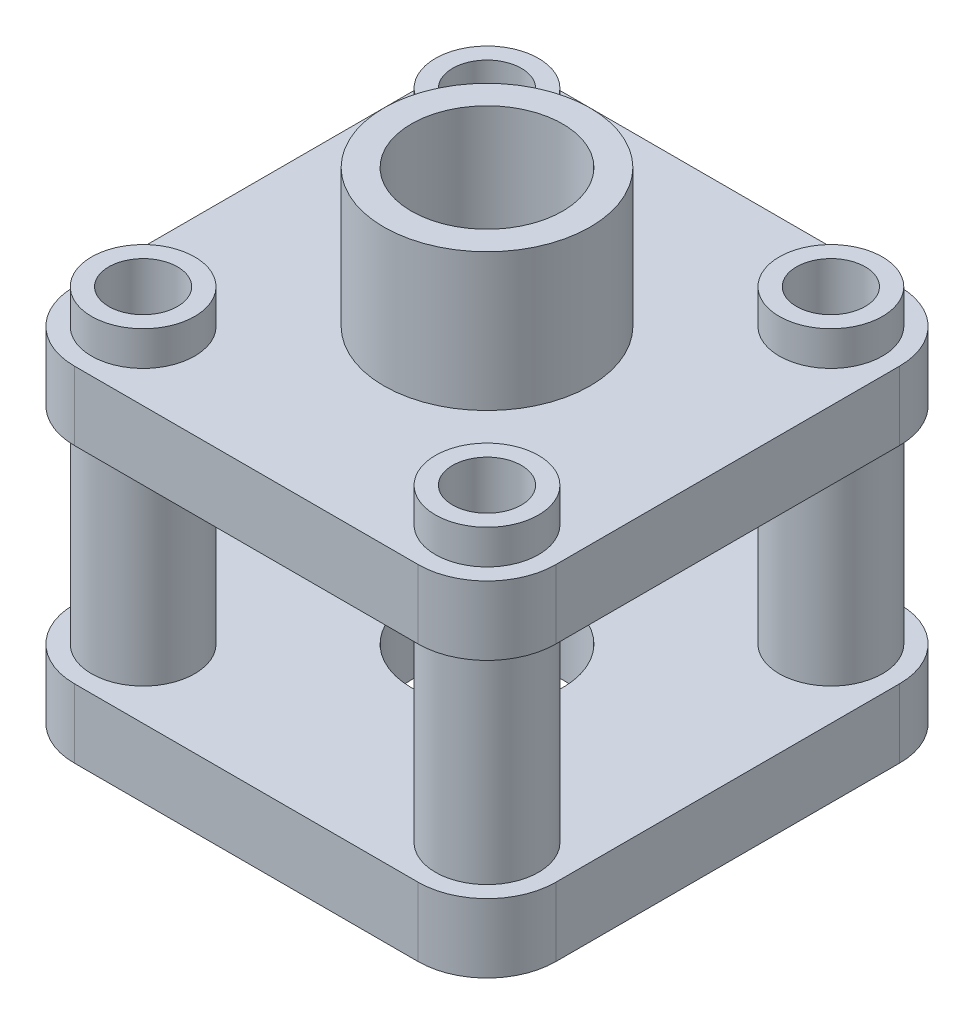
ISO-10303-21;
HEADER;
FILE_DESCRIPTION(('STEP AP214'),'2;1');
FILE_NAME('part.step','',(''),(''),'','','');
FILE_SCHEMA(('AUTOMOTIVE_DESIGN { 1 0 10303 214 1 1 1 1 }'));
ENDSEC;
DATA;
#1=APPLICATION_CONTEXT('core data for automotive mechanical design processes');
#2=APPLICATION_PROTOCOL_DEFINITION('international standard','automotive_design',2000,#1);
#3=PRODUCT_CONTEXT('',#1,'mechanical');
#4=PRODUCT('Part','Part','',(#3));
#5=PRODUCT_RELATED_PRODUCT_CATEGORY('part','',(#4));
#6=PRODUCT_DEFINITION_FORMATION('','',#4);
#7=PRODUCT_DEFINITION_CONTEXT('part definition',#1,'design');
#8=PRODUCT_DEFINITION('design','',#6,#7);
#9=PRODUCT_DEFINITION_SHAPE('','',#8);
#10=(LENGTH_UNIT() NAMED_UNIT(*) SI_UNIT(.MILLI.,.METRE.));
#11=(NAMED_UNIT(*) PLANE_ANGLE_UNIT() SI_UNIT($,.RADIAN.));
#12=(NAMED_UNIT(*) SI_UNIT($,.STERADIAN.) SOLID_ANGLE_UNIT());
#13=UNCERTAINTY_MEASURE_WITH_UNIT(LENGTH_MEASURE(1.E-05),#10,'distance_accuracy_value','');
#14=(GEOMETRIC_REPRESENTATION_CONTEXT(3) GLOBAL_UNCERTAINTY_ASSIGNED_CONTEXT((#13)) GLOBAL_UNIT_ASSIGNED_CONTEXT((#10,
#11,#12)) REPRESENTATION_CONTEXT('',''));
#15=CARTESIAN_POINT('',(0.,0.,0.));
#16=DIRECTION('',(0.,0.,1.));
#17=DIRECTION('',(1.,0.,0.));
#18=AXIS2_PLACEMENT_3D('',#15,#16,#17);
#19=CARTESIAN_POINT('',(-25.,40.,-25.));
#20=DIRECTION('',(0.,-1.,0.));
#21=DIRECTION('',(0.,0.,-1.));
#22=AXIS2_PLACEMENT_3D('',#19,#20,#21);
#23=CYLINDRICAL_SURFACE('',#22,7.5);
#24=CARTESIAN_POINT('',(-25.,10.,-25.));
#25=DIRECTION('',(0.,1.,0.));
#26=DIRECTION('',(0.,0.,1.));
#27=AXIS2_PLACEMENT_3D('',#24,#25,#26);
#28=CIRCLE('',#27,7.5);
#29=CARTESIAN_POINT('',(-25.,10.,-17.5));
#30=VERTEX_POINT('',#29);
#31=EDGE_CURVE('E143',#30,#30,#28,.F.);
#32=ORIENTED_EDGE('',*,*,#31,.F.);
#33=EDGE_LOOP('',(#32));
#34=FACE_BOUND('',#33,.T.);
#35=CARTESIAN_POINT('',(-25.,40.,-25.));
#36=DIRECTION('',(0.,1.,0.));
#37=DIRECTION('',(0.,0.,1.));
#38=AXIS2_PLACEMENT_3D('',#35,#36,#37);
#39=CIRCLE('',#38,7.5);
#40=CARTESIAN_POINT('',(-25.,40.,-17.5));
#41=VERTEX_POINT('',#40);
#42=EDGE_CURVE('E11',#41,#41,#39,.T.);
#43=ORIENTED_EDGE('',*,*,#42,.F.);
#44=EDGE_LOOP('',(#43));
#45=FACE_BOUND('',#44,.T.);
#46=ADVANCED_FACE('F39',(#34,#45),#23,.T.);
#47=CARTESIAN_POINT('',(25.,40.,-25.));
#48=DIRECTION('',(0.,-1.,0.));
#49=DIRECTION('',(0.,0.,-1.));
#50=AXIS2_PLACEMENT_3D('',#47,#48,#49);
#51=CYLINDRICAL_SURFACE('',#50,7.49999999999999);
#52=CARTESIAN_POINT('',(25.,10.,-25.));
#53=DIRECTION('',(0.,1.,0.));
#54=DIRECTION('',(0.,0.,1.));
#55=AXIS2_PLACEMENT_3D('',#52,#53,#54);
#56=CIRCLE('',#55,7.49999999999999);
#57=CARTESIAN_POINT('',(25.,10.,-17.5));
#58=VERTEX_POINT('',#57);
#59=EDGE_CURVE('E189',#58,#58,#56,.T.);
#60=ORIENTED_EDGE('',*,*,#59,.T.);
#61=EDGE_LOOP('',(#60));
#62=FACE_BOUND('',#61,.T.);
#63=CARTESIAN_POINT('',(25.,40.,-25.));
#64=DIRECTION('',(0.,1.,0.));
#65=DIRECTION('',(0.,0.,1.));
#66=AXIS2_PLACEMENT_3D('',#63,#64,#65);
#67=CIRCLE('',#66,7.49999999999999);
#68=CARTESIAN_POINT('',(25.,40.,-17.5));
#69=VERTEX_POINT('',#68);
#70=EDGE_CURVE('E339',#69,#69,#67,.T.);
#71=ORIENTED_EDGE('',*,*,#70,.F.);
#72=EDGE_LOOP('',(#71));
#73=FACE_BOUND('',#72,.T.);
#74=ADVANCED_FACE('F208',(#62,#73),#51,.T.);
#75=CARTESIAN_POINT('',(-25.,40.,25.));
#76=DIRECTION('',(0.,-1.,0.));
#77=DIRECTION('',(0.,0.,-1.));
#78=AXIS2_PLACEMENT_3D('',#75,#76,#77);
#79=CYLINDRICAL_SURFACE('',#78,7.5);
#80=CARTESIAN_POINT('',(-25.,10.,25.));
#81=DIRECTION('',(0.,1.,0.));
#82=DIRECTION('',(0.,0.,1.));
#83=AXIS2_PLACEMENT_3D('',#80,#81,#82);
#84=CIRCLE('',#83,7.5);
#85=CARTESIAN_POINT('',(-25.,10.,32.5));
#86=VERTEX_POINT('',#85);
#87=EDGE_CURVE('E194',#86,#86,#84,.T.);
#88=ORIENTED_EDGE('',*,*,#87,.T.);
#89=EDGE_LOOP('',(#88));
#90=FACE_BOUND('',#89,.T.);
#91=CARTESIAN_POINT('',(-25.,40.,25.));
#92=DIRECTION('',(0.,1.,0.));
#93=DIRECTION('',(0.,0.,1.));
#94=AXIS2_PLACEMENT_3D('',#91,#92,#93);
#95=CIRCLE('',#94,7.5);
#96=CARTESIAN_POINT('',(-25.,40.,32.5));
#97=VERTEX_POINT('',#96);
#98=EDGE_CURVE('E341',#97,#97,#95,.T.);
#99=ORIENTED_EDGE('',*,*,#98,.F.);
#100=EDGE_LOOP('',(#99));
#101=FACE_BOUND('',#100,.T.);
#102=ADVANCED_FACE('F282',(#90,#101),#79,.T.);
#103=CARTESIAN_POINT('',(25.,40.,25.));
#104=DIRECTION('',(0.,-1.,0.));
#105=DIRECTION('',(0.,0.,-1.));
#106=AXIS2_PLACEMENT_3D('',#103,#104,#105);
#107=CYLINDRICAL_SURFACE('',#106,7.49999999999999);
#108=CARTESIAN_POINT('',(25.,10.,25.));
#109=DIRECTION('',(0.,1.,0.));
#110=DIRECTION('',(0.,0.,1.));
#111=AXIS2_PLACEMENT_3D('',#108,#109,#110);
#112=CIRCLE('',#111,7.49999999999999);
#113=CARTESIAN_POINT('',(25.,10.,32.5));
#114=VERTEX_POINT('',#113);
#115=EDGE_CURVE('E232',#114,#114,#112,.F.);
#116=ORIENTED_EDGE('',*,*,#115,.F.);
#117=EDGE_LOOP('',(#116));
#118=FACE_BOUND('',#117,.T.);
#119=CARTESIAN_POINT('',(25.,40.,25.));
#120=DIRECTION('',(0.,1.,0.));
#121=DIRECTION('',(0.,0.,1.));
#122=AXIS2_PLACEMENT_3D('',#119,#120,#121);
#123=CIRCLE('',#122,7.49999999999999);
#124=CARTESIAN_POINT('',(25.,40.,32.5));
#125=VERTEX_POINT('',#124);
#126=EDGE_CURVE('E190',#125,#125,#123,.T.);
#127=ORIENTED_EDGE('',*,*,#126,.F.);
#128=EDGE_LOOP('',(#127));
#129=FACE_BOUND('',#128,.T.);
#130=ADVANCED_FACE('F413',(#118,#129),#107,.T.);
#131=CARTESIAN_POINT('',(0.,10.,-35.));
#132=DIRECTION('',(0.,0.,-1.));
#133=DIRECTION('',(-1.,0.,0.));
#134=AXIS2_PLACEMENT_3D('',#131,#132,#133);
#135=PLANE('',#134);
#136=DIRECTION('',(1.,0.,0.));
#137=VECTOR('',#136,1.);
#138=CARTESIAN_POINT('',(0.,0.,-35.));
#139=LINE('',#138,#137);
#140=CARTESIAN_POINT('',(-24.9999999999999,0.,-35.));
#141=VERTEX_POINT('',#140);
#142=CARTESIAN_POINT('',(24.9999999999999,0.,-35.));
#143=VERTEX_POINT('',#142);
#144=EDGE_CURVE('E142',#141,#143,#139,.T.);
#145=ORIENTED_EDGE('',*,*,#144,.F.);
#146=DIRECTION('',(0.,-1.,0.));
#147=VECTOR('',#146,1.);
#148=CARTESIAN_POINT('',(-24.9999999999999,10.,-35.));
#149=LINE('',#148,#147);
#150=CARTESIAN_POINT('',(-24.9999999999999,10.,-35.));
#151=VERTEX_POINT('',#150);
#152=EDGE_CURVE('E92',#151,#141,#149,.T.);
#153=ORIENTED_EDGE('',*,*,#152,.F.);
#154=DIRECTION('',(1.,0.,0.));
#155=VECTOR('',#154,1.);
#156=CARTESIAN_POINT('',(0.,10.,-35.));
#157=LINE('',#156,#155);
#158=CARTESIAN_POINT('',(24.9999999999999,10.,-35.));
#159=VERTEX_POINT('',#158);
#160=EDGE_CURVE('E243',#151,#159,#157,.T.);
#161=ORIENTED_EDGE('',*,*,#160,.T.);
#162=DIRECTION('',(0.,-1.,0.));
#163=VECTOR('',#162,1.);
#164=CARTESIAN_POINT('',(24.9999999999999,10.,-35.));
#165=LINE('',#164,#163);
#166=EDGE_CURVE('E56',#159,#143,#165,.T.);
#167=ORIENTED_EDGE('',*,*,#166,.T.);
#168=EDGE_LOOP('',(#145,#153,#161,#167));
#169=FACE_BOUND('',#168,.T.);
#170=ADVANCED_FACE('F424',(#169),#135,.T.);
#171=CARTESIAN_POINT('',(-25.,10.,-25.));
#172=DIRECTION('',(0.,-1.,0.));
#173=DIRECTION('',(0.,0.,-1.));
#174=AXIS2_PLACEMENT_3D('',#171,#172,#173);
#175=CYLINDRICAL_SURFACE('',#174,10.);
#176=CARTESIAN_POINT('',(-25.,0.,-25.));
#177=DIRECTION('',(0.,1.,0.));
#178=DIRECTION('',(0.,0.,1.));
#179=AXIS2_PLACEMENT_3D('',#176,#177,#178);
#180=CIRCLE('',#179,10.);
#181=CARTESIAN_POINT('',(-35.,0.,-24.9999999999999));
#182=VERTEX_POINT('',#181);
#183=EDGE_CURVE('E145',#141,#182,#180,.T.);
#184=ORIENTED_EDGE('',*,*,#183,.T.);
#185=DIRECTION('',(0.,-1.,0.));
#186=VECTOR('',#185,1.);
#187=CARTESIAN_POINT('',(-35.,10.,-24.9999999999999));
#188=LINE('',#187,#186);
#189=CARTESIAN_POINT('',(-35.,10.,-24.9999999999999));
#190=VERTEX_POINT('',#189);
#191=EDGE_CURVE('E185',#190,#182,#188,.T.);
#192=ORIENTED_EDGE('',*,*,#191,.F.);
#193=CARTESIAN_POINT('',(-25.,10.,-25.));
#194=DIRECTION('',(0.,1.,0.));
#195=DIRECTION('',(0.,0.,1.));
#196=AXIS2_PLACEMENT_3D('',#193,#194,#195);
#197=CIRCLE('',#196,10.);
#198=EDGE_CURVE('E245',#151,#190,#197,.T.);
#199=ORIENTED_EDGE('',*,*,#198,.F.);
#200=ORIENTED_EDGE('',*,*,#152,.T.);
#201=EDGE_LOOP('',(#184,#192,#199,#200));
#202=FACE_BOUND('',#201,.T.);
#203=ADVANCED_FACE('F430',(#202),#175,.T.);
#204=CARTESIAN_POINT('',(-35.,10.,0.));
#205=DIRECTION('',(1.,0.,0.));
#206=DIRECTION('',(0.,0.,-1.));
#207=AXIS2_PLACEMENT_3D('',#204,#205,#206);
#208=PLANE('',#207);
#209=DIRECTION('',(0.,0.,1.));
#210=VECTOR('',#209,1.);
#211=CARTESIAN_POINT('',(-35.,0.,0.));
#212=LINE('',#211,#210);
#213=CARTESIAN_POINT('',(-35.,0.,24.9999999999999));
#214=VERTEX_POINT('',#213);
#215=EDGE_CURVE('E148',#182,#214,#212,.T.);
#216=ORIENTED_EDGE('',*,*,#215,.T.);
#217=DIRECTION('',(0.,-1.,0.));
#218=VECTOR('',#217,1.);
#219=CARTESIAN_POINT('',(-35.,10.,24.9999999999999));
#220=LINE('',#219,#218);
#221=CARTESIAN_POINT('',(-35.,10.,24.9999999999999));
#222=VERTEX_POINT('',#221);
#223=EDGE_CURVE('E182',#222,#214,#220,.T.);
#224=ORIENTED_EDGE('',*,*,#223,.F.);
#225=DIRECTION('',(0.,0.,1.));
#226=VECTOR('',#225,1.);
#227=CARTESIAN_POINT('',(-35.,10.,0.));
#228=LINE('',#227,#226);
#229=EDGE_CURVE('E248',#190,#222,#228,.T.);
#230=ORIENTED_EDGE('',*,*,#229,.F.);
#231=ORIENTED_EDGE('',*,*,#191,.T.);
#232=EDGE_LOOP('',(#216,#224,#230,#231));
#233=FACE_BOUND('',#232,.T.);
#234=ADVANCED_FACE('F825',(#233),#208,.F.);
#235=CARTESIAN_POINT('',(-25.,10.,25.));
#236=DIRECTION('',(0.,-1.,0.));
#237=DIRECTION('',(0.,0.,-1.));
#238=AXIS2_PLACEMENT_3D('',#235,#236,#237);
#239=CYLINDRICAL_SURFACE('',#238,10.);
#240=CARTESIAN_POINT('',(-25.,0.,25.));
#241=DIRECTION('',(0.,1.,0.));
#242=DIRECTION('',(0.,0.,1.));
#243=AXIS2_PLACEMENT_3D('',#240,#241,#242);
#244=CIRCLE('',#243,10.);
#245=CARTESIAN_POINT('',(-24.9999999999999,0.,35.));
#246=VERTEX_POINT('',#245);
#247=EDGE_CURVE('E151',#214,#246,#244,.T.);
#248=ORIENTED_EDGE('',*,*,#247,.T.);
#249=DIRECTION('',(0.,-1.,0.));
#250=VECTOR('',#249,1.);
#251=CARTESIAN_POINT('',(-24.9999999999999,10.,35.));
#252=LINE('',#251,#250);
#253=CARTESIAN_POINT('',(-24.9999999999999,10.,35.));
#254=VERTEX_POINT('',#253);
#255=EDGE_CURVE('E179',#254,#246,#252,.T.);
#256=ORIENTED_EDGE('',*,*,#255,.F.);
#257=CARTESIAN_POINT('',(-25.,10.,25.));
#258=DIRECTION('',(0.,1.,0.));
#259=DIRECTION('',(0.,0.,1.));
#260=AXIS2_PLACEMENT_3D('',#257,#258,#259);
#261=CIRCLE('',#260,10.);
#262=EDGE_CURVE('E251',#222,#254,#261,.T.);
#263=ORIENTED_EDGE('',*,*,#262,.F.);
#264=ORIENTED_EDGE('',*,*,#223,.T.);
#265=EDGE_LOOP('',(#248,#256,#263,#264));
#266=FACE_BOUND('',#265,.T.);
#267=ADVANCED_FACE('F255',(#266),#239,.T.);
#268=CARTESIAN_POINT('',(0.,10.,35.));
#269=DIRECTION('',(0.,0.,-1.));
#270=DIRECTION('',(-1.,0.,0.));
#271=AXIS2_PLACEMENT_3D('',#268,#269,#270);
#272=PLANE('',#271);
#273=DIRECTION('',(1.,0.,0.));
#274=VECTOR('',#273,1.);
#275=CARTESIAN_POINT('',(0.,0.,35.));
#276=LINE('',#275,#274);
#277=CARTESIAN_POINT('',(24.9999999999999,0.,35.));
#278=VERTEX_POINT('',#277);
#279=EDGE_CURVE('E154',#246,#278,#276,.T.);
#280=ORIENTED_EDGE('',*,*,#279,.T.);
#281=DIRECTION('',(0.,-1.,0.));
#282=VECTOR('',#281,1.);
#283=CARTESIAN_POINT('',(24.9999999999999,10.,35.));
#284=LINE('',#283,#282);
#285=CARTESIAN_POINT('',(24.9999999999999,10.,35.));
#286=VERTEX_POINT('',#285);
#287=EDGE_CURVE('E131',#286,#278,#284,.T.);
#288=ORIENTED_EDGE('',*,*,#287,.F.);
#289=DIRECTION('',(1.,0.,0.));
#290=VECTOR('',#289,1.);
#291=CARTESIAN_POINT('',(0.,10.,35.));
#292=LINE('',#291,#290);
#293=EDGE_CURVE('E120',#254,#286,#292,.T.);
#294=ORIENTED_EDGE('',*,*,#293,.F.);
#295=ORIENTED_EDGE('',*,*,#255,.T.);
#296=EDGE_LOOP('',(#280,#288,#294,#295));
#297=FACE_BOUND('',#296,.T.);
#298=ADVANCED_FACE('F257',(#297),#272,.F.);
#299=CARTESIAN_POINT('',(25.,10.,25.));
#300=DIRECTION('',(0.,-1.,0.));
#301=DIRECTION('',(0.,0.,-1.));
#302=AXIS2_PLACEMENT_3D('',#299,#300,#301);
#303=CYLINDRICAL_SURFACE('',#302,10.);
#304=CARTESIAN_POINT('',(25.,0.,25.));
#305=DIRECTION('',(0.,1.,0.));
#306=DIRECTION('',(0.,0.,1.));
#307=AXIS2_PLACEMENT_3D('',#304,#305,#306);
#308=CIRCLE('',#307,10.);
#309=CARTESIAN_POINT('',(35.,0.,24.9999999999999));
#310=VERTEX_POINT('',#309);
#311=EDGE_CURVE('E128',#278,#310,#308,.T.);
#312=ORIENTED_EDGE('',*,*,#311,.T.);
#313=DIRECTION('',(0.,-1.,0.));
#314=VECTOR('',#313,1.);
#315=CARTESIAN_POINT('',(35.,10.,24.9999999999999));
#316=LINE('',#315,#314);
#317=CARTESIAN_POINT('',(35.,10.,24.9999999999999));
#318=VERTEX_POINT('',#317);
#319=EDGE_CURVE('E126',#318,#310,#316,.T.);
#320=ORIENTED_EDGE('',*,*,#319,.F.);
#321=CARTESIAN_POINT('',(25.,10.,25.));
#322=DIRECTION('',(0.,1.,0.));
#323=DIRECTION('',(0.,0.,1.));
#324=AXIS2_PLACEMENT_3D('',#321,#322,#323);
#325=CIRCLE('',#324,10.);
#326=EDGE_CURVE('E112',#286,#318,#325,.T.);
#327=ORIENTED_EDGE('',*,*,#326,.F.);
#328=ORIENTED_EDGE('',*,*,#287,.T.);
#329=EDGE_LOOP('',(#312,#320,#327,#328));
#330=FACE_BOUND('',#329,.T.);
#331=ADVANCED_FACE('F127',(#330),#303,.T.);
#332=CARTESIAN_POINT('',(35.,10.,0.));
#333=DIRECTION('',(1.,0.,0.));
#334=DIRECTION('',(0.,0.,-1.));
#335=AXIS2_PLACEMENT_3D('',#332,#333,#334);
#336=PLANE('',#335);
#337=DIRECTION('',(0.,0.,1.));
#338=VECTOR('',#337,1.);
#339=CARTESIAN_POINT('',(35.,0.,0.));
#340=LINE('',#339,#338);
#341=CARTESIAN_POINT('',(35.,0.,-24.9999999999999));
#342=VERTEX_POINT('',#341);
#343=EDGE_CURVE('E158',#342,#310,#340,.T.);
#344=ORIENTED_EDGE('',*,*,#343,.F.);
#345=DIRECTION('',(0.,-1.,0.));
#346=VECTOR('',#345,1.);
#347=CARTESIAN_POINT('',(35.,10.,-24.9999999999999));
#348=LINE('',#347,#346);
#349=CARTESIAN_POINT('',(35.,10.,-24.9999999999999));
#350=VERTEX_POINT('',#349);
#351=EDGE_CURVE('E83',#350,#342,#348,.T.);
#352=ORIENTED_EDGE('',*,*,#351,.F.);
#353=DIRECTION('',(0.,0.,1.));
#354=VECTOR('',#353,1.);
#355=CARTESIAN_POINT('',(35.,10.,0.));
#356=LINE('',#355,#354);
#357=EDGE_CURVE('E118',#350,#318,#356,.T.);
#358=ORIENTED_EDGE('',*,*,#357,.T.);
#359=ORIENTED_EDGE('',*,*,#319,.T.);
#360=EDGE_LOOP('',(#344,#352,#358,#359));
#361=FACE_BOUND('',#360,.T.);
#362=ADVANCED_FACE('F133',(#361),#336,.T.);
#363=CARTESIAN_POINT('',(-25.,10.,-25.));
#364=DIRECTION('',(0.,-1.,0.));
#365=DIRECTION('',(0.,0.,-1.));
#366=AXIS2_PLACEMENT_3D('',#363,#364,#365);
#367=CYLINDRICAL_SURFACE('',#366,5.);
#368=CARTESIAN_POINT('',(-25.,0.,-25.));
#369=DIRECTION('',(0.,1.,0.));
#370=DIRECTION('',(0.,0.,1.));
#371=AXIS2_PLACEMENT_3D('',#368,#369,#370);
#372=CIRCLE('',#371,5.);
#373=CARTESIAN_POINT('',(-25.,0.,-20.));
#374=VERTEX_POINT('',#373);
#375=EDGE_CURVE('E169',#374,#374,#372,.T.);
#376=ORIENTED_EDGE('',*,*,#375,.F.);
#377=EDGE_LOOP('',(#376));
#378=FACE_BOUND('',#377,.T.);
#379=CARTESIAN_POINT('',(-25.,55.,-25.));
#380=DIRECTION('',(0.,1.,0.));
#381=DIRECTION('',(0.,0.,1.));
#382=AXIS2_PLACEMENT_3D('',#379,#380,#381);
#383=CIRCLE('',#382,5.);
#384=CARTESIAN_POINT('',(-25.,55.,-20.));
#385=VERTEX_POINT('',#384);
#386=EDGE_CURVE('E217',#385,#385,#383,.F.);
#387=ORIENTED_EDGE('',*,*,#386,.F.);
#388=EDGE_LOOP('',(#387));
#389=FACE_BOUND('',#388,.T.);
#390=ADVANCED_FACE('F308',(#378,#389),#367,.F.);
#391=CARTESIAN_POINT('',(25.,10.,-25.));
#392=DIRECTION('',(0.,-1.,0.));
#393=DIRECTION('',(0.,0.,-1.));
#394=AXIS2_PLACEMENT_3D('',#391,#392,#393);
#395=CYLINDRICAL_SURFACE('',#394,4.99999999999999);
#396=CARTESIAN_POINT('',(25.,0.,-25.));
#397=DIRECTION('',(0.,1.,0.));
#398=DIRECTION('',(0.,0.,1.));
#399=AXIS2_PLACEMENT_3D('',#396,#397,#398);
#400=CIRCLE('',#399,4.99999999999999);
#401=CARTESIAN_POINT('',(25.,0.,-20.));
#402=VERTEX_POINT('',#401);
#403=EDGE_CURVE('E166',#402,#402,#400,.F.);
#404=ORIENTED_EDGE('',*,*,#403,.T.);
#405=EDGE_LOOP('',(#404));
#406=FACE_BOUND('',#405,.T.);
#407=CARTESIAN_POINT('',(25.,55.,-25.));
#408=DIRECTION('',(0.,1.,0.));
#409=DIRECTION('',(0.,0.,1.));
#410=AXIS2_PLACEMENT_3D('',#407,#408,#409);
#411=CIRCLE('',#410,4.99999999999999);
#412=CARTESIAN_POINT('',(25.,55.,-20.));
#413=VERTEX_POINT('',#412);
#414=EDGE_CURVE('E214',#413,#413,#411,.T.);
#415=ORIENTED_EDGE('',*,*,#414,.T.);
#416=EDGE_LOOP('',(#415));
#417=FACE_BOUND('',#416,.T.);
#418=ADVANCED_FACE('F272',(#406,#417),#395,.F.);
#419=CARTESIAN_POINT('',(-25.,10.,25.));
#420=DIRECTION('',(0.,-1.,0.));
#421=DIRECTION('',(0.,0.,-1.));
#422=AXIS2_PLACEMENT_3D('',#419,#420,#421);
#423=CYLINDRICAL_SURFACE('',#422,5.);
#424=CARTESIAN_POINT('',(-25.,0.,25.));
#425=DIRECTION('',(0.,1.,0.));
#426=DIRECTION('',(0.,0.,1.));
#427=AXIS2_PLACEMENT_3D('',#424,#425,#426);
#428=CIRCLE('',#427,5.);
#429=CARTESIAN_POINT('',(-25.,0.,30.));
#430=VERTEX_POINT('',#429);
#431=EDGE_CURVE('E163',#430,#430,#428,.F.);
#432=ORIENTED_EDGE('',*,*,#431,.T.);
#433=EDGE_LOOP('',(#432));
#434=FACE_BOUND('',#433,.T.);
#435=CARTESIAN_POINT('',(-25.,55.,25.));
#436=DIRECTION('',(0.,1.,0.));
#437=DIRECTION('',(0.,0.,1.));
#438=AXIS2_PLACEMENT_3D('',#435,#436,#437);
#439=CIRCLE('',#438,5.);
#440=CARTESIAN_POINT('',(-25.,55.,30.));
#441=VERTEX_POINT('',#440);
#442=EDGE_CURVE('E226',#441,#441,#439,.T.);
#443=ORIENTED_EDGE('',*,*,#442,.T.);
#444=EDGE_LOOP('',(#443));
#445=FACE_BOUND('',#444,.T.);
#446=ADVANCED_FACE('F264',(#434,#445),#423,.F.);
#447=CARTESIAN_POINT('',(25.,10.,-25.));
#448=DIRECTION('',(0.,-1.,0.));
#449=DIRECTION('',(0.,0.,-1.));
#450=AXIS2_PLACEMENT_3D('',#447,#448,#449);
#451=CYLINDRICAL_SURFACE('',#450,10.);
#452=CARTESIAN_POINT('',(25.,0.,-25.));
#453=DIRECTION('',(0.,1.,0.));
#454=DIRECTION('',(0.,0.,1.));
#455=AXIS2_PLACEMENT_3D('',#452,#453,#454);
#456=CIRCLE('',#455,10.);
#457=EDGE_CURVE('E160',#143,#342,#456,.F.);
#458=ORIENTED_EDGE('',*,*,#457,.F.);
#459=ORIENTED_EDGE('',*,*,#166,.F.);
#460=CARTESIAN_POINT('',(25.,10.,-25.));
#461=DIRECTION('',(0.,1.,0.));
#462=DIRECTION('',(0.,0.,1.));
#463=AXIS2_PLACEMENT_3D('',#460,#461,#462);
#464=CIRCLE('',#463,10.);
#465=EDGE_CURVE('E134',#159,#350,#464,.F.);
#466=ORIENTED_EDGE('',*,*,#465,.T.);
#467=ORIENTED_EDGE('',*,*,#351,.T.);
#468=EDGE_LOOP('',(#458,#459,#466,#467));
#469=FACE_BOUND('',#468,.T.);
#470=ADVANCED_FACE('F262',(#469),#451,.T.);
#471=CARTESIAN_POINT('',(0.,10.,0.));
#472=DIRECTION('',(0.,-1.,0.));
#473=DIRECTION('',(0.,0.,-1.));
#474=AXIS2_PLACEMENT_3D('',#471,#472,#473);
#475=CYLINDRICAL_SURFACE('',#474,11.);
#476=CARTESIAN_POINT('',(0.,10.,0.));
#477=DIRECTION('',(0.,1.,0.));
#478=DIRECTION('',(0.,0.,1.));
#479=AXIS2_PLACEMENT_3D('',#476,#477,#478);
#480=CIRCLE('',#479,11.);
#481=CARTESIAN_POINT('',(0.,10.,11.));
#482=VERTEX_POINT('',#481);
#483=EDGE_CURVE('E175',#482,#482,#480,.T.);
#484=ORIENTED_EDGE('',*,*,#483,.T.);
#485=EDGE_LOOP('',(#484));
#486=FACE_BOUND('',#485,.T.);
#487=CARTESIAN_POINT('',(0.,0.,0.));
#488=DIRECTION('',(0.,1.,0.));
#489=DIRECTION('',(0.,0.,1.));
#490=AXIS2_PLACEMENT_3D('',#487,#488,#489);
#491=CIRCLE('',#490,11.);
#492=CARTESIAN_POINT('',(0.,0.,11.));
#493=VERTEX_POINT('',#492);
#494=EDGE_CURVE('E139',#493,#493,#491,.T.);
#495=ORIENTED_EDGE('',*,*,#494,.F.);
#496=EDGE_LOOP('',(#495));
#497=FACE_BOUND('',#496,.T.);
#498=ADVANCED_FACE('F41',(#486,#497),#475,.F.);
#499=CARTESIAN_POINT('',(25.,10.,25.));
#500=DIRECTION('',(0.,-1.,0.));
#501=DIRECTION('',(0.,0.,-1.));
#502=AXIS2_PLACEMENT_3D('',#499,#500,#501);
#503=CYLINDRICAL_SURFACE('',#502,4.99999999999999);
#504=CARTESIAN_POINT('',(25.,0.,25.));
#505=DIRECTION('',(0.,1.,0.));
#506=DIRECTION('',(0.,0.,1.));
#507=AXIS2_PLACEMENT_3D('',#504,#505,#506);
#508=CIRCLE('',#507,4.99999999999999);
#509=CARTESIAN_POINT('',(25.,0.,30.));
#510=VERTEX_POINT('',#509);
#511=EDGE_CURVE('E172',#510,#510,#508,.T.);
#512=ORIENTED_EDGE('',*,*,#511,.F.);
#513=EDGE_LOOP('',(#512));
#514=FACE_BOUND('',#513,.T.);
#515=CARTESIAN_POINT('',(25.,55.,25.));
#516=DIRECTION('',(0.,1.,0.));
#517=DIRECTION('',(0.,0.,1.));
#518=AXIS2_PLACEMENT_3D('',#515,#516,#517);
#519=CIRCLE('',#518,4.99999999999999);
#520=CARTESIAN_POINT('',(25.,55.,30.));
#521=VERTEX_POINT('',#520);
#522=EDGE_CURVE('E402',#521,#521,#519,.T.);
#523=ORIENTED_EDGE('',*,*,#522,.T.);
#524=EDGE_LOOP('',(#523));
#525=FACE_BOUND('',#524,.T.);
#526=ADVANCED_FACE('F270',(#514,#525),#503,.F.);
#527=CARTESIAN_POINT('',(0.,10.,0.));
#528=DIRECTION('',(0.,1.,0.));
#529=DIRECTION('',(0.,0.,1.));
#530=AXIS2_PLACEMENT_3D('',#527,#528,#529);
#531=PLANE('',#530);
#532=ORIENTED_EDGE('',*,*,#115,.T.);
#533=EDGE_LOOP('',(#532));
#534=FACE_BOUND('',#533,.T.);
#535=ORIENTED_EDGE('',*,*,#87,.F.);
#536=EDGE_LOOP('',(#535));
#537=FACE_BOUND('',#536,.T.);
#538=ORIENTED_EDGE('',*,*,#59,.F.);
#539=EDGE_LOOP('',(#538));
#540=FACE_BOUND('',#539,.T.);
#541=ORIENTED_EDGE('',*,*,#31,.T.);
#542=EDGE_LOOP('',(#541));
#543=FACE_BOUND('',#542,.T.);
#544=ORIENTED_EDGE('',*,*,#483,.F.);
#545=EDGE_LOOP('',(#544));
#546=FACE_BOUND('',#545,.T.);
#547=ORIENTED_EDGE('',*,*,#160,.F.);
#548=ORIENTED_EDGE('',*,*,#198,.T.);
#549=ORIENTED_EDGE('',*,*,#229,.T.);
#550=ORIENTED_EDGE('',*,*,#262,.T.);
#551=ORIENTED_EDGE('',*,*,#293,.T.);
#552=ORIENTED_EDGE('',*,*,#326,.T.);
#553=ORIENTED_EDGE('',*,*,#357,.F.);
#554=ORIENTED_EDGE('',*,*,#465,.F.);
#555=EDGE_LOOP('',(#547,#548,#549,#550,#551,#552,#553,#554));
#556=FACE_BOUND('',#555,.T.);
#557=ADVANCED_FACE('F115',(#534,#537,#540,#543,#546,#556),#531,.T.);
#558=CARTESIAN_POINT('',(0.,0.,0.));
#559=DIRECTION('',(0.,1.,0.));
#560=DIRECTION('',(0.,0.,1.));
#561=AXIS2_PLACEMENT_3D('',#558,#559,#560);
#562=PLANE('',#561);
#563=ORIENTED_EDGE('',*,*,#494,.T.);
#564=EDGE_LOOP('',(#563));
#565=FACE_BOUND('',#564,.T.);
#566=ORIENTED_EDGE('',*,*,#144,.T.);
#567=ORIENTED_EDGE('',*,*,#457,.T.);
#568=ORIENTED_EDGE('',*,*,#343,.T.);
#569=ORIENTED_EDGE('',*,*,#311,.F.);
#570=ORIENTED_EDGE('',*,*,#279,.F.);
#571=ORIENTED_EDGE('',*,*,#247,.F.);
#572=ORIENTED_EDGE('',*,*,#215,.F.);
#573=ORIENTED_EDGE('',*,*,#183,.F.);
#574=EDGE_LOOP('',(#566,#567,#568,#569,#570,#571,#572,#573));
#575=FACE_BOUND('',#574,.T.);
#576=ORIENTED_EDGE('',*,*,#375,.T.);
#577=EDGE_LOOP('',(#576));
#578=FACE_BOUND('',#577,.T.);
#579=ORIENTED_EDGE('',*,*,#403,.F.);
#580=EDGE_LOOP('',(#579));
#581=FACE_BOUND('',#580,.T.);
#582=ORIENTED_EDGE('',*,*,#431,.F.);
#583=EDGE_LOOP('',(#582));
#584=FACE_BOUND('',#583,.T.);
#585=ORIENTED_EDGE('',*,*,#511,.T.);
#586=EDGE_LOOP('',(#585));
#587=FACE_BOUND('',#586,.T.);
#588=ADVANCED_FACE('F259',(#565,#575,#578,#581,#584,#587),#562,.F.);
#589=CARTESIAN_POINT('',(-25.,50.,-25.));
#590=DIRECTION('',(0.,1.,0.));
#591=DIRECTION('',(0.,0.,1.));
#592=AXIS2_PLACEMENT_3D('',#589,#590,#591);
#593=CIRCLE('',#592,7.5);
#594=CARTESIAN_POINT('',(-25.,50.,-17.5));
#595=VERTEX_POINT('',#594);
#596=EDGE_CURVE('E297',#595,#595,#593,.T.);
#597=ORIENTED_EDGE('',*,*,#596,.T.);
#598=EDGE_LOOP('',(#597));
#599=FACE_BOUND('',#598,.T.);
#600=CARTESIAN_POINT('',(-25.,55.,-25.));
#601=DIRECTION('',(0.,1.,0.));
#602=DIRECTION('',(0.,0.,1.));
#603=AXIS2_PLACEMENT_3D('',#600,#601,#602);
#604=CIRCLE('',#603,7.5);
#605=CARTESIAN_POINT('',(-25.,55.,-17.5));
#606=VERTEX_POINT('',#605);
#607=EDGE_CURVE('E213',#606,#606,#604,.T.);
#608=ORIENTED_EDGE('',*,*,#607,.F.);
#609=EDGE_LOOP('',(#608));
#610=FACE_BOUND('',#609,.T.);
#611=ADVANCED_FACE('F206',(#599,#610),#23,.T.);
#612=CARTESIAN_POINT('',(25.,50.,-25.));
#613=DIRECTION('',(0.,1.,0.));
#614=DIRECTION('',(0.,0.,1.));
#615=AXIS2_PLACEMENT_3D('',#612,#613,#614);
#616=CIRCLE('',#615,7.49999999999999);
#617=CARTESIAN_POINT('',(25.,50.,-17.5));
#618=VERTEX_POINT('',#617);
#619=EDGE_CURVE('E48',#618,#618,#616,.F.);
#620=ORIENTED_EDGE('',*,*,#619,.F.);
#621=EDGE_LOOP('',(#620));
#622=FACE_BOUND('',#621,.T.);
#623=CARTESIAN_POINT('',(25.,55.,-25.));
#624=DIRECTION('',(0.,1.,0.));
#625=DIRECTION('',(0.,0.,1.));
#626=AXIS2_PLACEMENT_3D('',#623,#624,#625);
#627=CIRCLE('',#626,7.49999999999999);
#628=CARTESIAN_POINT('',(25.,55.,-17.5));
#629=VERTEX_POINT('',#628);
#630=EDGE_CURVE('E211',#629,#629,#627,.T.);
#631=ORIENTED_EDGE('',*,*,#630,.F.);
#632=EDGE_LOOP('',(#631));
#633=FACE_BOUND('',#632,.T.);
#634=ADVANCED_FACE('F202',(#622,#633),#51,.T.);
#635=CARTESIAN_POINT('',(-25.,50.,25.));
#636=DIRECTION('',(0.,1.,0.));
#637=DIRECTION('',(0.,0.,1.));
#638=AXIS2_PLACEMENT_3D('',#635,#636,#637);
#639=CIRCLE('',#638,7.5);
#640=CARTESIAN_POINT('',(-25.,50.,32.5));
#641=VERTEX_POINT('',#640);
#642=EDGE_CURVE('E193',#641,#641,#639,.F.);
#643=ORIENTED_EDGE('',*,*,#642,.F.);
#644=EDGE_LOOP('',(#643));
#645=FACE_BOUND('',#644,.T.);
#646=CARTESIAN_POINT('',(-25.,55.,25.));
#647=DIRECTION('',(0.,1.,0.));
#648=DIRECTION('',(0.,0.,1.));
#649=AXIS2_PLACEMENT_3D('',#646,#647,#648);
#650=CIRCLE('',#649,7.5);
#651=CARTESIAN_POINT('',(-25.,55.,32.5));
#652=VERTEX_POINT('',#651);
#653=EDGE_CURVE('E229',#652,#652,#650,.T.);
#654=ORIENTED_EDGE('',*,*,#653,.F.);
#655=EDGE_LOOP('',(#654));
#656=FACE_BOUND('',#655,.T.);
#657=ADVANCED_FACE('F205',(#645,#656),#79,.T.);
#658=CARTESIAN_POINT('',(25.,50.,25.));
#659=DIRECTION('',(0.,1.,0.));
#660=DIRECTION('',(0.,0.,1.));
#661=AXIS2_PLACEMENT_3D('',#658,#659,#660);
#662=CIRCLE('',#661,7.49999999999999);
#663=CARTESIAN_POINT('',(25.,50.,32.5));
#664=VERTEX_POINT('',#663);
#665=EDGE_CURVE('E458',#664,#664,#662,.T.);
#666=ORIENTED_EDGE('',*,*,#665,.T.);
#667=EDGE_LOOP('',(#666));
#668=FACE_BOUND('',#667,.T.);
#669=CARTESIAN_POINT('',(25.,55.,25.));
#670=DIRECTION('',(0.,1.,0.));
#671=DIRECTION('',(0.,0.,1.));
#672=AXIS2_PLACEMENT_3D('',#669,#670,#671);
#673=CIRCLE('',#672,7.49999999999999);
#674=CARTESIAN_POINT('',(25.,55.,32.5));
#675=VERTEX_POINT('',#674);
#676=EDGE_CURVE('E220',#675,#675,#673,.T.);
#677=ORIENTED_EDGE('',*,*,#676,.F.);
#678=EDGE_LOOP('',(#677));
#679=FACE_BOUND('',#678,.T.);
#680=ADVANCED_FACE('F409',(#668,#679),#107,.T.);
#681=CARTESIAN_POINT('',(0.,55.,0.));
#682=DIRECTION('',(0.,1.,0.));
#683=DIRECTION('',(0.,0.,1.));
#684=AXIS2_PLACEMENT_3D('',#681,#682,#683);
#685=PLANE('',#684);
#686=ORIENTED_EDGE('',*,*,#442,.F.);
#687=EDGE_LOOP('',(#686));
#688=FACE_BOUND('',#687,.T.);
#689=ORIENTED_EDGE('',*,*,#653,.T.);
#690=EDGE_LOOP('',(#689));
#691=FACE_BOUND('',#690,.T.);
#692=ADVANCED_FACE('F304',(#688,#691),#685,.T.);
#693=CARTESIAN_POINT('',(0.,55.,0.));
#694=DIRECTION('',(0.,1.,0.));
#695=DIRECTION('',(0.,0.,1.));
#696=AXIS2_PLACEMENT_3D('',#693,#694,#695);
#697=PLANE('',#696);
#698=ORIENTED_EDGE('',*,*,#607,.T.);
#699=EDGE_LOOP('',(#698));
#700=FACE_BOUND('',#699,.T.);
#701=ORIENTED_EDGE('',*,*,#386,.T.);
#702=EDGE_LOOP('',(#701));
#703=FACE_BOUND('',#702,.T.);
#704=ADVANCED_FACE('F300',(#700,#703),#697,.T.);
#705=CARTESIAN_POINT('',(0.,55.,0.));
#706=DIRECTION('',(0.,1.,0.));
#707=DIRECTION('',(0.,0.,1.));
#708=AXIS2_PLACEMENT_3D('',#705,#706,#707);
#709=PLANE('',#708);
#710=ORIENTED_EDGE('',*,*,#414,.F.);
#711=EDGE_LOOP('',(#710));
#712=FACE_BOUND('',#711,.T.);
#713=ORIENTED_EDGE('',*,*,#630,.T.);
#714=EDGE_LOOP('',(#713));
#715=FACE_BOUND('',#714,.T.);
#716=ADVANCED_FACE('F303',(#712,#715),#709,.T.);
#717=CARTESIAN_POINT('',(0.,55.,0.));
#718=DIRECTION('',(0.,1.,0.));
#719=DIRECTION('',(0.,0.,1.));
#720=AXIS2_PLACEMENT_3D('',#717,#718,#719);
#721=PLANE('',#720);
#722=ORIENTED_EDGE('',*,*,#522,.F.);
#723=EDGE_LOOP('',(#722));
#724=FACE_BOUND('',#723,.T.);
#725=ORIENTED_EDGE('',*,*,#676,.T.);
#726=EDGE_LOOP('',(#725));
#727=FACE_BOUND('',#726,.T.);
#728=ADVANCED_FACE('F407',(#724,#727),#721,.T.);
#729=CARTESIAN_POINT('',(35.,50.,0.));
#730=DIRECTION('',(-1.,0.,0.));
#731=DIRECTION('',(0.,0.,1.));
#732=AXIS2_PLACEMENT_3D('',#729,#730,#731);
#733=PLANE('',#732);
#734=DIRECTION('',(0.,0.,-1.));
#735=VECTOR('',#734,1.);
#736=CARTESIAN_POINT('',(35.,40.,0.));
#737=LINE('',#736,#735);
#738=CARTESIAN_POINT('',(35.,40.,24.9999999999999));
#739=VERTEX_POINT('',#738);
#740=CARTESIAN_POINT('',(35.,40.,-24.9999999999999));
#741=VERTEX_POINT('',#740);
#742=EDGE_CURVE('E345',#739,#741,#737,.T.);
#743=ORIENTED_EDGE('',*,*,#742,.T.);
#744=DIRECTION('',(0.,-1.,0.));
#745=VECTOR('',#744,1.);
#746=CARTESIAN_POINT('',(35.,50.,-24.9999999999999));
#747=LINE('',#746,#745);
#748=CARTESIAN_POINT('',(35.,50.,-24.9999999999999));
#749=VERTEX_POINT('',#748);
#750=EDGE_CURVE('E399',#749,#741,#747,.T.);
#751=ORIENTED_EDGE('',*,*,#750,.F.);
#752=DIRECTION('',(0.,0.,-1.));
#753=VECTOR('',#752,1.);
#754=CARTESIAN_POINT('',(35.,50.,0.));
#755=LINE('',#754,#753);
#756=CARTESIAN_POINT('',(35.,50.,24.9999999999999));
#757=VERTEX_POINT('',#756);
#758=EDGE_CURVE('E460',#757,#749,#755,.T.);
#759=ORIENTED_EDGE('',*,*,#758,.F.);
#760=DIRECTION('',(0.,-1.,0.));
#761=VECTOR('',#760,1.);
#762=CARTESIAN_POINT('',(35.,50.,24.9999999999999));
#763=LINE('',#762,#761);
#764=EDGE_CURVE('E378',#757,#739,#763,.T.);
#765=ORIENTED_EDGE('',*,*,#764,.T.);
#766=EDGE_LOOP('',(#743,#751,#759,#765));
#767=FACE_BOUND('',#766,.T.);
#768=ADVANCED_FACE('F493',(#767),#733,.F.);
#769=CARTESIAN_POINT('',(25.,50.,-25.));
#770=DIRECTION('',(0.,-1.,0.));
#771=DIRECTION('',(0.,0.,-1.));
#772=AXIS2_PLACEMENT_3D('',#769,#770,#771);
#773=CYLINDRICAL_SURFACE('',#772,10.);
#774=CARTESIAN_POINT('',(25.,40.,-25.));
#775=DIRECTION('',(0.,1.,0.));
#776=DIRECTION('',(0.,0.,1.));
#777=AXIS2_PLACEMENT_3D('',#774,#775,#776);
#778=CIRCLE('',#777,10.);
#779=CARTESIAN_POINT('',(24.9999999999999,40.,-35.));
#780=VERTEX_POINT('',#779);
#781=EDGE_CURVE('E356',#741,#780,#778,.T.);
#782=ORIENTED_EDGE('',*,*,#781,.T.);
#783=DIRECTION('',(0.,-1.,0.));
#784=VECTOR('',#783,1.);
#785=CARTESIAN_POINT('',(24.9999999999999,50.,-35.));
#786=LINE('',#785,#784);
#787=CARTESIAN_POINT('',(24.9999999999999,50.,-35.));
#788=VERTEX_POINT('',#787);
#789=EDGE_CURVE('E396',#788,#780,#786,.T.);
#790=ORIENTED_EDGE('',*,*,#789,.F.);
#791=CARTESIAN_POINT('',(25.,50.,-25.));
#792=DIRECTION('',(0.,1.,0.));
#793=DIRECTION('',(0.,0.,1.));
#794=AXIS2_PLACEMENT_3D('',#791,#792,#793);
#795=CIRCLE('',#794,10.);
#796=EDGE_CURVE('E463',#749,#788,#795,.T.);
#797=ORIENTED_EDGE('',*,*,#796,.F.);
#798=ORIENTED_EDGE('',*,*,#750,.T.);
#799=EDGE_LOOP('',(#782,#790,#797,#798));
#800=FACE_BOUND('',#799,.T.);
#801=ADVANCED_FACE('F499',(#800),#773,.T.);
#802=CARTESIAN_POINT('',(0.,50.,-35.));
#803=DIRECTION('',(0.,0.,1.));
#804=DIRECTION('',(1.,0.,0.));
#805=AXIS2_PLACEMENT_3D('',#802,#803,#804);
#806=PLANE('',#805);
#807=DIRECTION('',(-1.,0.,0.));
#808=VECTOR('',#807,1.);
#809=CARTESIAN_POINT('',(0.,40.,-35.));
#810=LINE('',#809,#808);
#811=CARTESIAN_POINT('',(-24.9999999999999,40.,-35.));
#812=VERTEX_POINT('',#811);
#813=EDGE_CURVE('E359',#780,#812,#810,.T.);
#814=ORIENTED_EDGE('',*,*,#813,.T.);
#815=DIRECTION('',(0.,-1.,0.));
#816=VECTOR('',#815,1.);
#817=CARTESIAN_POINT('',(-24.9999999999999,50.,-35.));
#818=LINE('',#817,#816);
#819=CARTESIAN_POINT('',(-24.9999999999999,50.,-35.));
#820=VERTEX_POINT('',#819);
#821=EDGE_CURVE('E393',#820,#812,#818,.T.);
#822=ORIENTED_EDGE('',*,*,#821,.F.);
#823=DIRECTION('',(-1.,0.,0.));
#824=VECTOR('',#823,1.);
#825=CARTESIAN_POINT('',(0.,50.,-35.));
#826=LINE('',#825,#824);
#827=EDGE_CURVE('E466',#788,#820,#826,.T.);
#828=ORIENTED_EDGE('',*,*,#827,.F.);
#829=ORIENTED_EDGE('',*,*,#789,.T.);
#830=EDGE_LOOP('',(#814,#822,#828,#829));
#831=FACE_BOUND('',#830,.T.);
#832=ADVANCED_FACE('F541',(#831),#806,.F.);
#833=CARTESIAN_POINT('',(-25.,50.,-25.));
#834=DIRECTION('',(0.,-1.,0.));
#835=DIRECTION('',(0.,0.,-1.));
#836=AXIS2_PLACEMENT_3D('',#833,#834,#835);
#837=CYLINDRICAL_SURFACE('',#836,10.);
#838=CARTESIAN_POINT('',(-25.,40.,-25.));
#839=DIRECTION('',(0.,1.,0.));
#840=DIRECTION('',(0.,0.,1.));
#841=AXIS2_PLACEMENT_3D('',#838,#839,#840);
#842=CIRCLE('',#841,10.);
#843=CARTESIAN_POINT('',(-35.,40.,-24.9999999999999));
#844=VERTEX_POINT('',#843);
#845=EDGE_CURVE('E362',#812,#844,#842,.T.);
#846=ORIENTED_EDGE('',*,*,#845,.T.);
#847=DIRECTION('',(0.,-1.,0.));
#848=VECTOR('',#847,1.);
#849=CARTESIAN_POINT('',(-35.,50.,-24.9999999999999));
#850=LINE('',#849,#848);
#851=CARTESIAN_POINT('',(-35.,50.,-24.9999999999999));
#852=VERTEX_POINT('',#851);
#853=EDGE_CURVE('E390',#852,#844,#850,.T.);
#854=ORIENTED_EDGE('',*,*,#853,.F.);
#855=CARTESIAN_POINT('',(-25.,50.,-25.));
#856=DIRECTION('',(0.,1.,0.));
#857=DIRECTION('',(0.,0.,1.));
#858=AXIS2_PLACEMENT_3D('',#855,#856,#857);
#859=CIRCLE('',#858,10.);
#860=EDGE_CURVE('E469',#820,#852,#859,.T.);
#861=ORIENTED_EDGE('',*,*,#860,.F.);
#862=ORIENTED_EDGE('',*,*,#821,.T.);
#863=EDGE_LOOP('',(#846,#854,#861,#862));
#864=FACE_BOUND('',#863,.T.);
#865=ADVANCED_FACE('F545',(#864),#837,.T.);
#866=CARTESIAN_POINT('',(-35.,50.,0.));
#867=DIRECTION('',(1.,0.,0.));
#868=DIRECTION('',(0.,0.,-1.));
#869=AXIS2_PLACEMENT_3D('',#866,#867,#868);
#870=PLANE('',#869);
#871=DIRECTION('',(0.,0.,1.));
#872=VECTOR('',#871,1.);
#873=CARTESIAN_POINT('',(-35.,40.,0.));
#874=LINE('',#873,#872);
#875=CARTESIAN_POINT('',(-35.,40.,24.9999999999999));
#876=VERTEX_POINT('',#875);
#877=EDGE_CURVE('E365',#844,#876,#874,.T.);
#878=ORIENTED_EDGE('',*,*,#877,.T.);
#879=DIRECTION('',(0.,-1.,0.));
#880=VECTOR('',#879,1.);
#881=CARTESIAN_POINT('',(-35.,50.,24.9999999999999));
#882=LINE('',#881,#880);
#883=CARTESIAN_POINT('',(-35.,50.,24.9999999999999));
#884=VERTEX_POINT('',#883);
#885=EDGE_CURVE('E387',#884,#876,#882,.T.);
#886=ORIENTED_EDGE('',*,*,#885,.F.);
#887=DIRECTION('',(0.,0.,1.));
#888=VECTOR('',#887,1.);
#889=CARTESIAN_POINT('',(-35.,50.,0.));
#890=LINE('',#889,#888);
#891=EDGE_CURVE('E472',#852,#884,#890,.T.);
#892=ORIENTED_EDGE('',*,*,#891,.F.);
#893=ORIENTED_EDGE('',*,*,#853,.T.);
#894=EDGE_LOOP('',(#878,#886,#892,#893));
#895=FACE_BOUND('',#894,.T.);
#896=ADVANCED_FACE('F530',(#895),#870,.F.);
#897=CARTESIAN_POINT('',(-25.,50.,25.));
#898=DIRECTION('',(0.,-1.,0.));
#899=DIRECTION('',(0.,0.,-1.));
#900=AXIS2_PLACEMENT_3D('',#897,#898,#899);
#901=CYLINDRICAL_SURFACE('',#900,10.);
#902=CARTESIAN_POINT('',(-25.,40.,25.));
#903=DIRECTION('',(0.,1.,0.));
#904=DIRECTION('',(0.,0.,1.));
#905=AXIS2_PLACEMENT_3D('',#902,#903,#904);
#906=CIRCLE('',#905,10.);
#907=CARTESIAN_POINT('',(-24.9999999999999,40.,35.));
#908=VERTEX_POINT('',#907);
#909=EDGE_CURVE('E368',#876,#908,#906,.T.);
#910=ORIENTED_EDGE('',*,*,#909,.T.);
#911=DIRECTION('',(0.,-1.,0.));
#912=VECTOR('',#911,1.);
#913=CARTESIAN_POINT('',(-24.9999999999999,50.,35.));
#914=LINE('',#913,#912);
#915=CARTESIAN_POINT('',(-24.9999999999999,50.,35.));
#916=VERTEX_POINT('',#915);
#917=EDGE_CURVE('E384',#916,#908,#914,.T.);
#918=ORIENTED_EDGE('',*,*,#917,.F.);
#919=CARTESIAN_POINT('',(-25.,50.,25.));
#920=DIRECTION('',(0.,1.,0.));
#921=DIRECTION('',(0.,0.,1.));
#922=AXIS2_PLACEMENT_3D('',#919,#920,#921);
#923=CIRCLE('',#922,10.);
#924=EDGE_CURVE('E475',#884,#916,#923,.T.);
#925=ORIENTED_EDGE('',*,*,#924,.F.);
#926=ORIENTED_EDGE('',*,*,#885,.T.);
#927=EDGE_LOOP('',(#910,#918,#925,#926));
#928=FACE_BOUND('',#927,.T.);
#929=ADVANCED_FACE('F523',(#928),#901,.T.);
#930=CARTESIAN_POINT('',(0.,50.,35.));
#931=DIRECTION('',(0.,0.,-1.));
#932=DIRECTION('',(-1.,0.,0.));
#933=AXIS2_PLACEMENT_3D('',#930,#931,#932);
#934=PLANE('',#933);
#935=DIRECTION('',(1.,0.,0.));
#936=VECTOR('',#935,1.);
#937=CARTESIAN_POINT('',(0.,40.,35.));
#938=LINE('',#937,#936);
#939=CARTESIAN_POINT('',(24.9999999999999,40.,35.));
#940=VERTEX_POINT('',#939);
#941=EDGE_CURVE('E371',#908,#940,#938,.T.);
#942=ORIENTED_EDGE('',*,*,#941,.T.);
#943=DIRECTION('',(0.,-1.,0.));
#944=VECTOR('',#943,1.);
#945=CARTESIAN_POINT('',(24.9999999999999,50.,35.));
#946=LINE('',#945,#944);
#947=CARTESIAN_POINT('',(24.9999999999999,50.,35.));
#948=VERTEX_POINT('',#947);
#949=EDGE_CURVE('E381',#948,#940,#946,.T.);
#950=ORIENTED_EDGE('',*,*,#949,.F.);
#951=DIRECTION('',(1.,0.,0.));
#952=VECTOR('',#951,1.);
#953=CARTESIAN_POINT('',(0.,50.,35.));
#954=LINE('',#953,#952);
#955=EDGE_CURVE('E477',#916,#948,#954,.T.);
#956=ORIENTED_EDGE('',*,*,#955,.F.);
#957=ORIENTED_EDGE('',*,*,#917,.T.);
#958=EDGE_LOOP('',(#942,#950,#956,#957));
#959=FACE_BOUND('',#958,.T.);
#960=ADVANCED_FACE('F517',(#959),#934,.F.);
#961=CARTESIAN_POINT('',(25.,50.,25.));
#962=DIRECTION('',(0.,-1.,0.));
#963=DIRECTION('',(0.,0.,-1.));
#964=AXIS2_PLACEMENT_3D('',#961,#962,#963);
#965=CYLINDRICAL_SURFACE('',#964,10.);
#966=CARTESIAN_POINT('',(25.,40.,25.));
#967=DIRECTION('',(0.,1.,0.));
#968=DIRECTION('',(0.,0.,1.));
#969=AXIS2_PLACEMENT_3D('',#966,#967,#968);
#970=CIRCLE('',#969,10.);
#971=EDGE_CURVE('E374',#940,#739,#970,.T.);
#972=ORIENTED_EDGE('',*,*,#971,.T.);
#973=ORIENTED_EDGE('',*,*,#764,.F.);
#974=CARTESIAN_POINT('',(25.,50.,25.));
#975=DIRECTION('',(0.,1.,0.));
#976=DIRECTION('',(0.,0.,1.));
#977=AXIS2_PLACEMENT_3D('',#974,#975,#976);
#978=CIRCLE('',#977,10.);
#979=EDGE_CURVE('E351',#948,#757,#978,.T.);
#980=ORIENTED_EDGE('',*,*,#979,.F.);
#981=ORIENTED_EDGE('',*,*,#949,.T.);
#982=EDGE_LOOP('',(#972,#973,#980,#981));
#983=FACE_BOUND('',#982,.T.);
#984=ADVANCED_FACE('F491',(#983),#965,.T.);
#985=CARTESIAN_POINT('',(0.,50.,0.));
#986=DIRECTION('',(0.,1.,0.));
#987=DIRECTION('',(0.,0.,1.));
#988=AXIS2_PLACEMENT_3D('',#985,#986,#987);
#989=PLANE('',#988);
#990=CARTESIAN_POINT('',(0.,50.,0.));
#991=DIRECTION('',(0.,1.,0.));
#992=DIRECTION('',(0.,0.,1.));
#993=AXIS2_PLACEMENT_3D('',#990,#991,#992);
#994=CIRCLE('',#993,15.);
#995=CARTESIAN_POINT('',(0.,50.,15.));
#996=VERTEX_POINT('',#995);
#997=EDGE_CURVE('E377',#996,#996,#994,.T.);
#998=ORIENTED_EDGE('',*,*,#997,.F.);
#999=EDGE_LOOP('',(#998));
#1000=FACE_BOUND('',#999,.T.);
#1001=ORIENTED_EDGE('',*,*,#596,.F.);
#1002=EDGE_LOOP('',(#1001));
#1003=FACE_BOUND('',#1002,.T.);
#1004=ORIENTED_EDGE('',*,*,#619,.T.);
#1005=EDGE_LOOP('',(#1004));
#1006=FACE_BOUND('',#1005,.T.);
#1007=ORIENTED_EDGE('',*,*,#665,.F.);
#1008=EDGE_LOOP('',(#1007));
#1009=FACE_BOUND('',#1008,.T.);
#1010=ORIENTED_EDGE('',*,*,#642,.T.);
#1011=EDGE_LOOP('',(#1010));
#1012=FACE_BOUND('',#1011,.T.);
#1013=ORIENTED_EDGE('',*,*,#758,.T.);
#1014=ORIENTED_EDGE('',*,*,#796,.T.);
#1015=ORIENTED_EDGE('',*,*,#827,.T.);
#1016=ORIENTED_EDGE('',*,*,#860,.T.);
#1017=ORIENTED_EDGE('',*,*,#891,.T.);
#1018=ORIENTED_EDGE('',*,*,#924,.T.);
#1019=ORIENTED_EDGE('',*,*,#955,.T.);
#1020=ORIENTED_EDGE('',*,*,#979,.T.);
#1021=EDGE_LOOP('',(#1013,#1014,#1015,#1016,#1017,#1018,#1019,#1020));
#1022=FACE_BOUND('',#1021,.T.);
#1023=ADVANCED_FACE('F199',(#1000,#1003,#1006,#1009,#1012,#1022),#989,.T.);
#1024=CARTESIAN_POINT('',(0.,40.,0.));
#1025=DIRECTION('',(0.,1.,0.));
#1026=DIRECTION('',(0.,0.,1.));
#1027=AXIS2_PLACEMENT_3D('',#1024,#1025,#1026);
#1028=PLANE('',#1027);
#1029=ORIENTED_EDGE('',*,*,#42,.T.);
#1030=EDGE_LOOP('',(#1029));
#1031=FACE_BOUND('',#1030,.T.);
#1032=ORIENTED_EDGE('',*,*,#70,.T.);
#1033=EDGE_LOOP('',(#1032));
#1034=FACE_BOUND('',#1033,.T.);
#1035=ORIENTED_EDGE('',*,*,#126,.T.);
#1036=EDGE_LOOP('',(#1035));
#1037=FACE_BOUND('',#1036,.T.);
#1038=ORIENTED_EDGE('',*,*,#98,.T.);
#1039=EDGE_LOOP('',(#1038));
#1040=FACE_BOUND('',#1039,.T.);
#1041=ORIENTED_EDGE('',*,*,#742,.F.);
#1042=ORIENTED_EDGE('',*,*,#971,.F.);
#1043=ORIENTED_EDGE('',*,*,#941,.F.);
#1044=ORIENTED_EDGE('',*,*,#909,.F.);
#1045=ORIENTED_EDGE('',*,*,#877,.F.);
#1046=ORIENTED_EDGE('',*,*,#845,.F.);
#1047=ORIENTED_EDGE('',*,*,#813,.F.);
#1048=ORIENTED_EDGE('',*,*,#781,.F.);
#1049=EDGE_LOOP('',(#1041,#1042,#1043,#1044,#1045,#1046,#1047,#1048));
#1050=FACE_BOUND('',#1049,.T.);
#1051=CARTESIAN_POINT('',(0.,40.,0.));
#1052=DIRECTION('',(0.,1.,0.));
#1053=DIRECTION('',(0.,0.,1.));
#1054=AXIS2_PLACEMENT_3D('',#1051,#1052,#1053);
#1055=CIRCLE('',#1054,11.);
#1056=CARTESIAN_POINT('',(0.,40.,11.));
#1057=VERTEX_POINT('',#1056);
#1058=EDGE_CURVE('E449',#1057,#1057,#1055,.T.);
#1059=ORIENTED_EDGE('',*,*,#1058,.T.);
#1060=EDGE_LOOP('',(#1059));
#1061=FACE_BOUND('',#1060,.T.);
#1062=ADVANCED_FACE('F435',(#1031,#1034,#1037,#1040,#1050,#1061),#1028,.F.);
#1063=CARTESIAN_POINT('',(0.,70.,0.));
#1064=DIRECTION('',(0.,-1.,0.));
#1065=DIRECTION('',(0.,0.,-1.));
#1066=AXIS2_PLACEMENT_3D('',#1063,#1064,#1065);
#1067=CYLINDRICAL_SURFACE('',#1066,11.);
#1068=CARTESIAN_POINT('',(0.,70.,0.));
#1069=DIRECTION('',(0.,1.,0.));
#1070=DIRECTION('',(0.,0.,1.));
#1071=AXIS2_PLACEMENT_3D('',#1068,#1069,#1070);
#1072=CIRCLE('',#1071,11.);
#1073=CARTESIAN_POINT('',(0.,70.,11.));
#1074=VERTEX_POINT('',#1073);
#1075=EDGE_CURVE('E348',#1074,#1074,#1072,.T.);
#1076=ORIENTED_EDGE('',*,*,#1075,.T.);
#1077=EDGE_LOOP('',(#1076));
#1078=FACE_BOUND('',#1077,.T.);
#1079=ORIENTED_EDGE('',*,*,#1058,.F.);
#1080=EDGE_LOOP('',(#1079));
#1081=FACE_BOUND('',#1080,.T.);
#1082=ADVANCED_FACE('F438',(#1078,#1081),#1067,.F.);
#1083=CARTESIAN_POINT('',(0.,70.,0.));
#1084=DIRECTION('',(0.,-1.,0.));
#1085=DIRECTION('',(0.,0.,-1.));
#1086=AXIS2_PLACEMENT_3D('',#1083,#1084,#1085);
#1087=CYLINDRICAL_SURFACE('',#1086,15.);
#1088=ORIENTED_EDGE('',*,*,#997,.T.);
#1089=EDGE_LOOP('',(#1088));
#1090=FACE_BOUND('',#1089,.T.);
#1091=CARTESIAN_POINT('',(0.,70.,0.));
#1092=DIRECTION('',(0.,1.,0.));
#1093=DIRECTION('',(0.,0.,1.));
#1094=AXIS2_PLACEMENT_3D('',#1091,#1092,#1093);
#1095=CIRCLE('',#1094,15.);
#1096=CARTESIAN_POINT('',(0.,70.,15.));
#1097=VERTEX_POINT('',#1096);
#1098=EDGE_CURVE('E342',#1097,#1097,#1095,.T.);
#1099=ORIENTED_EDGE('',*,*,#1098,.F.);
#1100=EDGE_LOOP('',(#1099));
#1101=FACE_BOUND('',#1100,.T.);
#1102=ADVANCED_FACE('F645',(#1090,#1101),#1087,.T.);
#1103=CARTESIAN_POINT('',(0.,70.,0.));
#1104=DIRECTION('',(0.,1.,0.));
#1105=DIRECTION('',(0.,0.,1.));
#1106=AXIS2_PLACEMENT_3D('',#1103,#1104,#1105);
#1107=PLANE('',#1106);
#1108=ORIENTED_EDGE('',*,*,#1075,.F.);
#1109=EDGE_LOOP('',(#1108));
#1110=FACE_BOUND('',#1109,.T.);
#1111=ORIENTED_EDGE('',*,*,#1098,.T.);
#1112=EDGE_LOOP('',(#1111));
#1113=FACE_BOUND('',#1112,.T.);
#1114=ADVANCED_FACE('F655',(#1110,#1113),#1107,.T.);
#1115=CLOSED_SHELL('',(#46,#74,#102,#130,#170,#203,#234,#267,#298,#331,#362,#390,#418,#446,#470,
#498,#526,#557,#588,#611,#634,#657,#680,#692,#704,#716,#728,#768,#801,#832,#865,#896,#929,#960,
#984,#1023,#1062,#1082,#1102,#1114));
#1116=MANIFOLD_SOLID_BREP('B2',#1115);
#1117=ADVANCED_BREP_SHAPE_REPRESENTATION('',(#18,#1116),#14);
#1118=SHAPE_DEFINITION_REPRESENTATION(#9,#1117);
ENDSEC;
END-ISO-10303-21;
